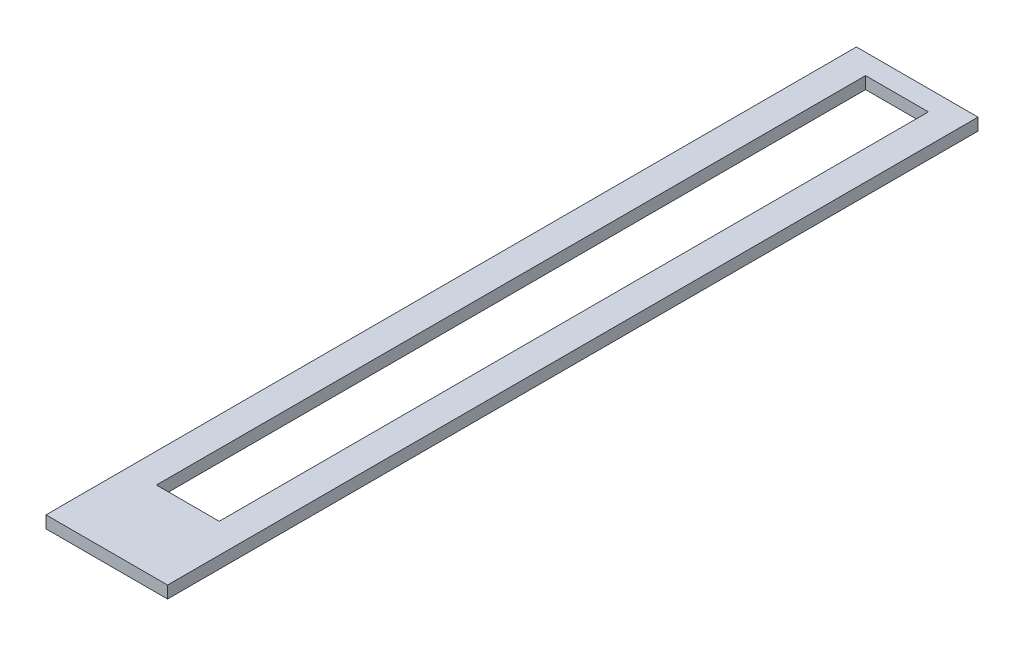
ISO-10303-21;
HEADER;
FILE_DESCRIPTION(('STEP AP214'),'2;1');
FILE_NAME('part.step','',(''),(''),'','','');
FILE_SCHEMA(('AUTOMOTIVE_DESIGN { 1 0 10303 214 1 1 1 1 }'));
ENDSEC;
DATA;
#1=APPLICATION_CONTEXT('core data for automotive mechanical design processes');
#2=APPLICATION_PROTOCOL_DEFINITION('international standard','automotive_design',2000,#1);
#3=PRODUCT_CONTEXT('',#1,'mechanical');
#4=PRODUCT('Part','Part','',(#3));
#5=PRODUCT_RELATED_PRODUCT_CATEGORY('part','',(#4));
#6=PRODUCT_DEFINITION_FORMATION('','',#4);
#7=PRODUCT_DEFINITION_CONTEXT('part definition',#1,'design');
#8=PRODUCT_DEFINITION('design','',#6,#7);
#9=PRODUCT_DEFINITION_SHAPE('','',#8);
#10=(LENGTH_UNIT() NAMED_UNIT(*) SI_UNIT(.MILLI.,.METRE.));
#11=(NAMED_UNIT(*) PLANE_ANGLE_UNIT() SI_UNIT($,.RADIAN.));
#12=(NAMED_UNIT(*) SI_UNIT($,.STERADIAN.) SOLID_ANGLE_UNIT());
#13=UNCERTAINTY_MEASURE_WITH_UNIT(LENGTH_MEASURE(1.E-05),#10,'distance_accuracy_value','');
#14=(GEOMETRIC_REPRESENTATION_CONTEXT(3) GLOBAL_UNCERTAINTY_ASSIGNED_CONTEXT((#13)) GLOBAL_UNIT_ASSIGNED_CONTEXT((#10,
#11,#12)) REPRESENTATION_CONTEXT('',''));
#15=CARTESIAN_POINT('',(0.,0.,0.));
#16=DIRECTION('',(0.,0.,1.));
#17=DIRECTION('',(1.,0.,0.));
#18=AXIS2_PLACEMENT_3D('',#15,#16,#17);
#19=CARTESIAN_POINT('',(15.,3.,100.));
#20=DIRECTION('',(-1.,0.,0.));
#21=DIRECTION('',(0.,0.,1.));
#22=AXIS2_PLACEMENT_3D('',#19,#20,#21);
#23=PLANE('',#22);
#24=DIRECTION('',(0.,0.,-1.));
#25=VECTOR('',#24,1.);
#26=CARTESIAN_POINT('',(15.,0.,100.));
#27=LINE('',#26,#25);
#28=CARTESIAN_POINT('',(15.,0.,100.));
#29=VERTEX_POINT('',#28);
#30=CARTESIAN_POINT('',(15.,0.,-99.9999999999999));
#31=VERTEX_POINT('',#30);
#32=EDGE_CURVE('E140',#29,#31,#27,.T.);
#33=ORIENTED_EDGE('',*,*,#32,.T.);
#34=DIRECTION('',(0.,-1.,0.));
#35=VECTOR('',#34,1.);
#36=CARTESIAN_POINT('',(15.,3.,-99.9999999999999));
#37=LINE('',#36,#35);
#38=CARTESIAN_POINT('',(15.,3.,-99.9999999999999));
#39=VERTEX_POINT('',#38);
#40=EDGE_CURVE('E182',#39,#31,#37,.T.);
#41=ORIENTED_EDGE('',*,*,#40,.F.);
#42=DIRECTION('',(0.,0.,-1.));
#43=VECTOR('',#42,1.);
#44=CARTESIAN_POINT('',(15.,3.,100.));
#45=LINE('',#44,#43);
#46=CARTESIAN_POINT('',(15.,3.,100.));
#47=VERTEX_POINT('',#46);
#48=EDGE_CURVE('E145',#47,#39,#45,.T.);
#49=ORIENTED_EDGE('',*,*,#48,.F.);
#50=DIRECTION('',(0.,-1.,0.));
#51=VECTOR('',#50,1.);
#52=CARTESIAN_POINT('',(15.,3.,100.));
#53=LINE('',#52,#51);
#54=EDGE_CURVE('E159',#47,#29,#53,.T.);
#55=ORIENTED_EDGE('',*,*,#54,.T.);
#56=EDGE_LOOP('',(#33,#41,#49,#55));
#57=FACE_BOUND('',#56,.T.);
#58=ADVANCED_FACE('F45',(#57),#23,.F.);
#59=CARTESIAN_POINT('',(-15.,3.,-99.9999999999999));
#60=DIRECTION('',(0.,0.,1.));
#61=DIRECTION('',(1.,0.,0.));
#62=AXIS2_PLACEMENT_3D('',#59,#60,#61);
#63=PLANE('',#62);
#64=DIRECTION('',(-1.,0.,0.));
#65=VECTOR('',#64,1.);
#66=CARTESIAN_POINT('',(-15.,0.,-99.9999999999999));
#67=LINE('',#66,#65);
#68=CARTESIAN_POINT('',(-15.,0.,-99.9999999999999));
#69=VERTEX_POINT('',#68);
#70=EDGE_CURVE('E163',#31,#69,#67,.T.);
#71=ORIENTED_EDGE('',*,*,#70,.T.);
#72=DIRECTION('',(0.,-1.,0.));
#73=VECTOR('',#72,1.);
#74=CARTESIAN_POINT('',(-15.,3.,-99.9999999999999));
#75=LINE('',#74,#73);
#76=CARTESIAN_POINT('',(-15.,3.,-99.9999999999999));
#77=VERTEX_POINT('',#76);
#78=EDGE_CURVE('E178',#77,#69,#75,.T.);
#79=ORIENTED_EDGE('',*,*,#78,.F.);
#80=DIRECTION('',(-1.,0.,0.));
#81=VECTOR('',#80,1.);
#82=CARTESIAN_POINT('',(-15.,3.,-99.9999999999999));
#83=LINE('',#82,#81);
#84=EDGE_CURVE('E149',#39,#77,#83,.T.);
#85=ORIENTED_EDGE('',*,*,#84,.F.);
#86=ORIENTED_EDGE('',*,*,#40,.T.);
#87=EDGE_LOOP('',(#71,#79,#85,#86));
#88=FACE_BOUND('',#87,.T.);
#89=ADVANCED_FACE('F212',(#88),#63,.F.);
#90=CARTESIAN_POINT('',(-15.,3.,100.));
#91=DIRECTION('',(1.,0.,0.));
#92=DIRECTION('',(0.,0.,-1.));
#93=AXIS2_PLACEMENT_3D('',#90,#91,#92);
#94=PLANE('',#93);
#95=DIRECTION('',(0.,0.,1.));
#96=VECTOR('',#95,1.);
#97=CARTESIAN_POINT('',(-15.,0.,100.));
#98=LINE('',#97,#96);
#99=CARTESIAN_POINT('',(-15.,0.,100.));
#100=VERTEX_POINT('',#99);
#101=EDGE_CURVE('E166',#69,#100,#98,.T.);
#102=ORIENTED_EDGE('',*,*,#101,.T.);
#103=DIRECTION('',(0.,-1.,0.));
#104=VECTOR('',#103,1.);
#105=CARTESIAN_POINT('',(-15.,3.,100.));
#106=LINE('',#105,#104);
#107=CARTESIAN_POINT('',(-15.,3.,100.));
#108=VERTEX_POINT('',#107);
#109=EDGE_CURVE('E174',#108,#100,#106,.T.);
#110=ORIENTED_EDGE('',*,*,#109,.F.);
#111=DIRECTION('',(0.,0.,1.));
#112=VECTOR('',#111,1.);
#113=CARTESIAN_POINT('',(-15.,3.,100.));
#114=LINE('',#113,#112);
#115=EDGE_CURVE('E153',#77,#108,#114,.T.);
#116=ORIENTED_EDGE('',*,*,#115,.F.);
#117=ORIENTED_EDGE('',*,*,#78,.T.);
#118=EDGE_LOOP('',(#102,#110,#116,#117));
#119=FACE_BOUND('',#118,.T.);
#120=ADVANCED_FACE('F217',(#119),#94,.F.);
#121=CARTESIAN_POINT('',(-15.,3.,100.));
#122=DIRECTION('',(0.,0.,-1.));
#123=DIRECTION('',(-1.,0.,0.));
#124=AXIS2_PLACEMENT_3D('',#121,#122,#123);
#125=PLANE('',#124);
#126=DIRECTION('',(1.,0.,0.));
#127=VECTOR('',#126,1.);
#128=CARTESIAN_POINT('',(-15.,0.,100.));
#129=LINE('',#128,#127);
#130=EDGE_CURVE('E150',#100,#29,#129,.T.);
#131=ORIENTED_EDGE('',*,*,#130,.T.);
#132=ORIENTED_EDGE('',*,*,#54,.F.);
#133=DIRECTION('',(1.,0.,0.));
#134=VECTOR('',#133,1.);
#135=CARTESIAN_POINT('',(-15.,3.,100.));
#136=LINE('',#135,#134);
#137=EDGE_CURVE('E156',#108,#47,#136,.T.);
#138=ORIENTED_EDGE('',*,*,#137,.F.);
#139=ORIENTED_EDGE('',*,*,#109,.T.);
#140=EDGE_LOOP('',(#131,#132,#138,#139));
#141=FACE_BOUND('',#140,.T.);
#142=ADVANCED_FACE('F230',(#141),#125,.F.);
#143=CARTESIAN_POINT('',(0.,3.,0.));
#144=DIRECTION('',(0.,-1.,0.));
#145=DIRECTION('',(0.,0.,-1.));
#146=AXIS2_PLACEMENT_3D('',#143,#144,#145);
#147=PLANE('',#146);
#148=DIRECTION('',(1.,0.,0.));
#149=VECTOR('',#148,1.);
#150=CARTESIAN_POINT('',(-7.74999999999998,3.,80.0000000000001));
#151=LINE('',#150,#149);
#152=CARTESIAN_POINT('',(-7.74999999999998,3.,80.0000000000001));
#153=VERTEX_POINT('',#152);
#154=CARTESIAN_POINT('',(7.75000000000002,3.,80.0000000000001));
#155=VERTEX_POINT('',#154);
#156=EDGE_CURVE('E122',#153,#155,#151,.T.);
#157=ORIENTED_EDGE('',*,*,#156,.F.);
#158=DIRECTION('',(0.,0.,1.));
#159=VECTOR('',#158,1.);
#160=CARTESIAN_POINT('',(-7.75,3.,-94.9999999999999));
#161=LINE('',#160,#159);
#162=CARTESIAN_POINT('',(-7.75,3.,-94.9999999999999));
#163=VERTEX_POINT('',#162);
#164=EDGE_CURVE('E60',#163,#153,#161,.T.);
#165=ORIENTED_EDGE('',*,*,#164,.F.);
#166=DIRECTION('',(-1.,0.,0.));
#167=VECTOR('',#166,1.);
#168=CARTESIAN_POINT('',(-7.75,3.,-94.9999999999999));
#169=LINE('',#168,#167);
#170=CARTESIAN_POINT('',(7.75,3.,-94.9999999999999));
#171=VERTEX_POINT('',#170);
#172=EDGE_CURVE('E130',#171,#163,#169,.T.);
#173=ORIENTED_EDGE('',*,*,#172,.F.);
#174=DIRECTION('',(0.,0.,-1.));
#175=VECTOR('',#174,1.);
#176=CARTESIAN_POINT('',(7.75,3.,-94.9999999999999));
#177=LINE('',#176,#175);
#178=EDGE_CURVE('E112',#155,#171,#177,.T.);
#179=ORIENTED_EDGE('',*,*,#178,.F.);
#180=EDGE_LOOP('',(#157,#165,#173,#179));
#181=FACE_BOUND('',#180,.T.);
#182=ORIENTED_EDGE('',*,*,#48,.T.);
#183=ORIENTED_EDGE('',*,*,#84,.T.);
#184=ORIENTED_EDGE('',*,*,#115,.T.);
#185=ORIENTED_EDGE('',*,*,#137,.T.);
#186=EDGE_LOOP('',(#182,#183,#184,#185));
#187=FACE_BOUND('',#186,.T.);
#188=ADVANCED_FACE('F127',(#181,#187),#147,.F.);
#189=CARTESIAN_POINT('',(0.,0.,0.));
#190=DIRECTION('',(0.,-1.,0.));
#191=DIRECTION('',(0.,0.,-1.));
#192=AXIS2_PLACEMENT_3D('',#189,#190,#191);
#193=PLANE('',#192);
#194=DIRECTION('',(0.,0.,-1.));
#195=VECTOR('',#194,1.);
#196=CARTESIAN_POINT('',(-7.74999999999999,0.,0.));
#197=LINE('',#196,#195);
#198=CARTESIAN_POINT('',(-7.74999999999998,0.,80.0000000000001));
#199=VERTEX_POINT('',#198);
#200=CARTESIAN_POINT('',(-7.75,0.,-94.9999999999999));
#201=VERTEX_POINT('',#200);
#202=EDGE_CURVE('E11',#199,#201,#197,.T.);
#203=ORIENTED_EDGE('',*,*,#202,.F.);
#204=DIRECTION('',(-1.,0.,0.));
#205=VECTOR('',#204,1.);
#206=CARTESIAN_POINT('',(0.,0.,80.0000000000001));
#207=LINE('',#206,#205);
#208=CARTESIAN_POINT('',(7.75000000000002,0.,80.0000000000001));
#209=VERTEX_POINT('',#208);
#210=EDGE_CURVE('E186',#209,#199,#207,.T.);
#211=ORIENTED_EDGE('',*,*,#210,.F.);
#212=DIRECTION('',(0.,0.,1.));
#213=VECTOR('',#212,1.);
#214=CARTESIAN_POINT('',(7.75000000000001,0.,0.));
#215=LINE('',#214,#213);
#216=CARTESIAN_POINT('',(7.75,0.,-94.9999999999999));
#217=VERTEX_POINT('',#216);
#218=EDGE_CURVE('E115',#217,#209,#215,.T.);
#219=ORIENTED_EDGE('',*,*,#218,.F.);
#220=DIRECTION('',(1.,0.,0.));
#221=VECTOR('',#220,1.);
#222=CARTESIAN_POINT('',(0.,0.,-94.9999999999999));
#223=LINE('',#222,#221);
#224=EDGE_CURVE('E53',#201,#217,#223,.T.);
#225=ORIENTED_EDGE('',*,*,#224,.F.);
#226=EDGE_LOOP('',(#203,#211,#219,#225));
#227=FACE_BOUND('',#226,.T.);
#228=ORIENTED_EDGE('',*,*,#32,.F.);
#229=ORIENTED_EDGE('',*,*,#130,.F.);
#230=ORIENTED_EDGE('',*,*,#101,.F.);
#231=ORIENTED_EDGE('',*,*,#70,.F.);
#232=EDGE_LOOP('',(#228,#229,#230,#231));
#233=FACE_BOUND('',#232,.T.);
#234=ADVANCED_FACE('F197',(#227,#233),#193,.T.);
#235=CARTESIAN_POINT('',(-7.75,-2.,-94.9999999999999));
#236=DIRECTION('',(-1.,0.,0.));
#237=DIRECTION('',(0.,0.,1.));
#238=AXIS2_PLACEMENT_3D('',#235,#236,#237);
#239=PLANE('',#238);
#240=ORIENTED_EDGE('',*,*,#202,.T.);
#241=DIRECTION('',(0.,1.,0.));
#242=VECTOR('',#241,1.);
#243=CARTESIAN_POINT('',(-7.75,-2.,-94.9999999999999));
#244=LINE('',#243,#242);
#245=EDGE_CURVE('E137',#201,#163,#244,.T.);
#246=ORIENTED_EDGE('',*,*,#245,.T.);
#247=ORIENTED_EDGE('',*,*,#164,.T.);
#248=DIRECTION('',(0.,1.,0.));
#249=VECTOR('',#248,1.);
#250=CARTESIAN_POINT('',(-7.74999999999998,-2.,80.0000000000001));
#251=LINE('',#250,#249);
#252=EDGE_CURVE('E119',#199,#153,#251,.T.);
#253=ORIENTED_EDGE('',*,*,#252,.F.);
#254=EDGE_LOOP('',(#240,#246,#247,#253));
#255=FACE_BOUND('',#254,.T.);
#256=ADVANCED_FACE('F199',(#255),#239,.F.);
#257=CARTESIAN_POINT('',(-7.75,-2.,-94.9999999999999));
#258=DIRECTION('',(0.,0.,-1.));
#259=DIRECTION('',(-1.,0.,0.));
#260=AXIS2_PLACEMENT_3D('',#257,#258,#259);
#261=PLANE('',#260);
#262=ORIENTED_EDGE('',*,*,#224,.T.);
#263=DIRECTION('',(0.,1.,0.));
#264=VECTOR('',#263,1.);
#265=CARTESIAN_POINT('',(7.75,-2.,-94.9999999999999));
#266=LINE('',#265,#264);
#267=EDGE_CURVE('E118',#217,#171,#266,.T.);
#268=ORIENTED_EDGE('',*,*,#267,.T.);
#269=ORIENTED_EDGE('',*,*,#172,.T.);
#270=ORIENTED_EDGE('',*,*,#245,.F.);
#271=EDGE_LOOP('',(#262,#268,#269,#270));
#272=FACE_BOUND('',#271,.T.);
#273=ADVANCED_FACE('F194',(#272),#261,.F.);
#274=CARTESIAN_POINT('',(7.75,-2.,-94.9999999999999));
#275=DIRECTION('',(1.,0.,0.));
#276=DIRECTION('',(0.,0.,-1.));
#277=AXIS2_PLACEMENT_3D('',#274,#275,#276);
#278=PLANE('',#277);
#279=ORIENTED_EDGE('',*,*,#218,.T.);
#280=DIRECTION('',(0.,1.,0.));
#281=VECTOR('',#280,1.);
#282=CARTESIAN_POINT('',(7.75000000000002,-2.,80.0000000000001));
#283=LINE('',#282,#281);
#284=EDGE_CURVE('E68',#209,#155,#283,.T.);
#285=ORIENTED_EDGE('',*,*,#284,.T.);
#286=ORIENTED_EDGE('',*,*,#178,.T.);
#287=ORIENTED_EDGE('',*,*,#267,.F.);
#288=EDGE_LOOP('',(#279,#285,#286,#287));
#289=FACE_BOUND('',#288,.T.);
#290=ADVANCED_FACE('F109',(#289),#278,.F.);
#291=CARTESIAN_POINT('',(-7.74999999999998,-2.,80.0000000000001));
#292=DIRECTION('',(0.,0.,1.));
#293=DIRECTION('',(1.,0.,0.));
#294=AXIS2_PLACEMENT_3D('',#291,#292,#293);
#295=PLANE('',#294);
#296=ORIENTED_EDGE('',*,*,#210,.T.);
#297=ORIENTED_EDGE('',*,*,#252,.T.);
#298=ORIENTED_EDGE('',*,*,#156,.T.);
#299=ORIENTED_EDGE('',*,*,#284,.F.);
#300=EDGE_LOOP('',(#296,#297,#298,#299));
#301=FACE_BOUND('',#300,.T.);
#302=ADVANCED_FACE('F123',(#301),#295,.F.);
#303=CLOSED_SHELL('',(#58,#89,#120,#142,#188,#234,#256,#273,#290,#302));
#304=MANIFOLD_SOLID_BREP('B2',#303);
#305=ADVANCED_BREP_SHAPE_REPRESENTATION('',(#18,#304),#14);
#306=SHAPE_DEFINITION_REPRESENTATION(#9,#305);
ENDSEC;
END-ISO-10303-21;
